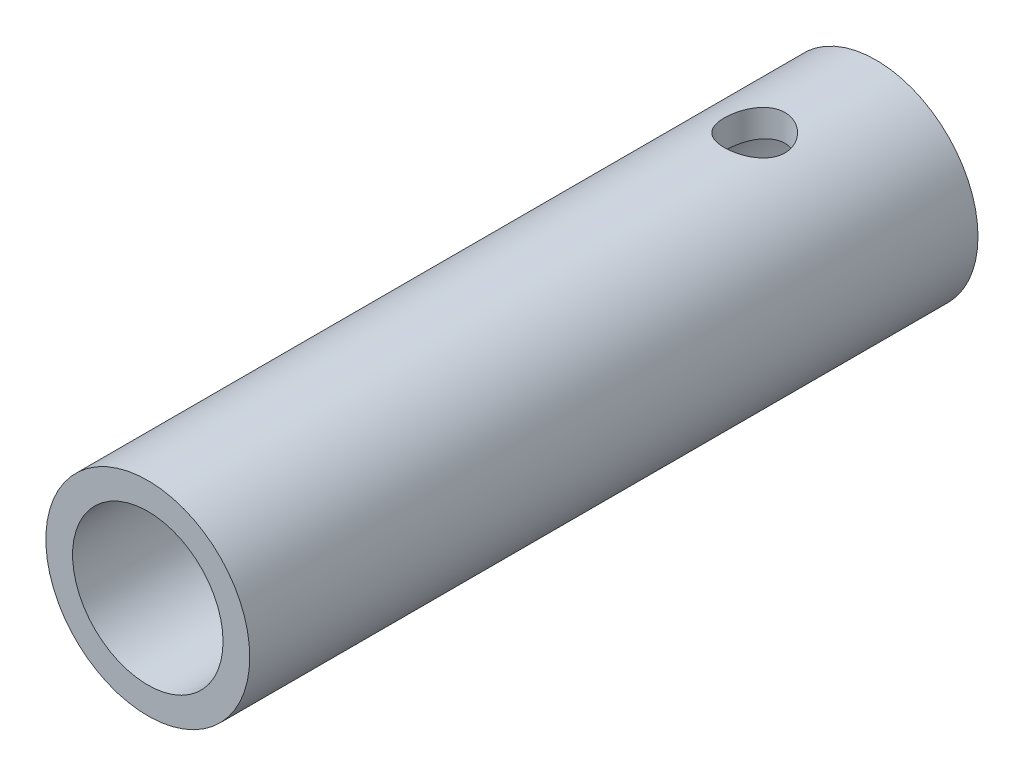
ISO-10303-21;
HEADER;
FILE_DESCRIPTION(('STEP AP214'),'2;1');
FILE_NAME('part.step','',(''),(''),'','','');
FILE_SCHEMA(('AUTOMOTIVE_DESIGN { 1 0 10303 214 1 1 1 1 }'));
ENDSEC;
DATA;
#1=APPLICATION_CONTEXT('core data for automotive mechanical design processes');
#2=APPLICATION_PROTOCOL_DEFINITION('international standard','automotive_design',2000,#1);
#3=PRODUCT_CONTEXT('',#1,'mechanical');
#4=PRODUCT('Part','Part','',(#3));
#5=PRODUCT_RELATED_PRODUCT_CATEGORY('part','',(#4));
#6=PRODUCT_DEFINITION_FORMATION('','',#4);
#7=PRODUCT_DEFINITION_CONTEXT('part definition',#1,'design');
#8=PRODUCT_DEFINITION('design','',#6,#7);
#9=PRODUCT_DEFINITION_SHAPE('','',#8);
#10=(LENGTH_UNIT() NAMED_UNIT(*) SI_UNIT(.MILLI.,.METRE.));
#11=(NAMED_UNIT(*) PLANE_ANGLE_UNIT() SI_UNIT($,.RADIAN.));
#12=(NAMED_UNIT(*) SI_UNIT($,.STERADIAN.) SOLID_ANGLE_UNIT());
#13=UNCERTAINTY_MEASURE_WITH_UNIT(LENGTH_MEASURE(1.E-05),#10,'distance_accuracy_value','');
#14=(GEOMETRIC_REPRESENTATION_CONTEXT(3) GLOBAL_UNCERTAINTY_ASSIGNED_CONTEXT((#13)) GLOBAL_UNIT_ASSIGNED_CONTEXT((#10,
#11,#12)) REPRESENTATION_CONTEXT('',''));
#15=CARTESIAN_POINT('',(0.,0.,0.));
#16=DIRECTION('',(0.,0.,1.));
#17=DIRECTION('',(1.,0.,0.));
#18=AXIS2_PLACEMENT_3D('',#15,#16,#17);
#19=CARTESIAN_POINT('',(0.,0.,76.2));
#20=DIRECTION('',(0.,0.,-1.));
#21=DIRECTION('',(-1.,0.,0.));
#22=AXIS2_PLACEMENT_3D('',#19,#20,#21);
#23=CYLINDRICAL_SURFACE('',#22,10.668);
#24=CARTESIAN_POINT('',(0.,0.,0.));
#25=DIRECTION('',(0.,0.,1.));
#26=DIRECTION('',(1.,0.,0.));
#27=AXIS2_PLACEMENT_3D('',#24,#25,#26);
#28=CIRCLE('',#27,10.668);
#29=CARTESIAN_POINT('',(10.668,0.,0.));
#30=VERTEX_POINT('',#29);
#31=EDGE_CURVE('E43',#30,#30,#28,.T.);
#32=ORIENTED_EDGE('',*,*,#31,.T.);
#33=EDGE_LOOP('',(#32));
#34=FACE_BOUND('',#33,.T.);
#35=CARTESIAN_POINT('',(0.,0.,76.2));
#36=DIRECTION('',(0.,0.,1.));
#37=DIRECTION('',(1.,0.,0.));
#38=AXIS2_PLACEMENT_3D('',#35,#36,#37);
#39=CIRCLE('',#38,10.668);
#40=CARTESIAN_POINT('',(10.668,0.,76.2));
#41=VERTEX_POINT('',#40);
#42=EDGE_CURVE('E10',#41,#41,#39,.T.);
#43=ORIENTED_EDGE('',*,*,#42,.F.);
#44=EDGE_LOOP('',(#43));
#45=FACE_BOUND('',#44,.T.);
#46=CARTESIAN_POINT('',(0.,10.668,9.525));
#47=CARTESIAN_POINT('',(-0.174241325798979,10.6679983960858,9.52500228316298));
#48=CARTESIAN_POINT('',(-0.348505769718592,10.663690253687,9.53939092403072));
#49=CARTESIAN_POINT('',(-0.691963975244289,10.6469249119002,9.59643133889868));
#50=CARTESIAN_POINT('',(-0.861156138697905,10.6344651717849,9.63909192488252));
#51=CARTESIAN_POINT('',(-1.18946602529507,10.6027626306626,9.75112864588402));
#52=CARTESIAN_POINT('',(-1.34859808012051,10.5835297478454,9.82046573107152));
#53=CARTESIAN_POINT('',(-1.65297729371737,10.5402824385384,9.98372822521061));
#54=CARTESIAN_POINT('',(-1.79822266758611,10.5162673986012,10.0776567892044));
#55=CARTESIAN_POINT('',(-2.07481627478839,10.4652596895976,10.290237431406));
#56=CARTESIAN_POINT('',(-2.20571596367365,10.4382067296833,10.4094586216231));
#57=CARTESIAN_POINT('',(-2.44599015594712,10.3845338725826,10.6680270430581));
#58=CARTESIAN_POINT('',(-2.55536110629125,10.3579140475435,10.807377589801));
#59=CARTESIAN_POINT('',(-2.75182038420357,10.3074852210202,11.1060281772563));
#60=CARTESIAN_POINT('',(-2.83836360168893,10.2837512292981,11.265700658118));
#61=CARTESIAN_POINT('',(-2.98318793361104,10.2426813335056,11.598153105723));
#62=CARTESIAN_POINT('',(-3.04147571365023,10.2253439206801,11.7709299699419));
#63=CARTESIAN_POINT('',(-3.12652161842141,10.1996580464263,12.1196548209246));
#64=CARTESIAN_POINT('',(-3.15410568071774,10.1910746627368,12.2953836161652));
#65=CARTESIAN_POINT('',(-3.17953994989377,10.1831695936336,12.6491682162967));
#66=CARTESIAN_POINT('',(-3.17739723298511,10.1838457040741,12.8272234573148));
#67=CARTESIAN_POINT('',(-3.14408802463311,10.194174868979,13.1739109025234));
#68=CARTESIAN_POINT('',(-3.11395355565029,10.2035087059639,13.3426533429279));
#69=CARTESIAN_POINT('',(-3.02718257140115,10.229585605295,13.67257019289));
#70=CARTESIAN_POINT('',(-2.97054347796374,10.2463293884166,13.8337438645359));
#71=CARTESIAN_POINT('',(-2.83160492525776,10.2855962413935,14.1464846873133));
#72=CARTESIAN_POINT('',(-2.74896875243333,10.3081944171753,14.2978924171281));
#73=CARTESIAN_POINT('',(-2.56061586104352,10.3565873921407,14.5850389975501));
#74=CARTESIAN_POINT('',(-2.45489362522584,10.3823829548177,14.7207740907372));
#75=CARTESIAN_POINT('',(-2.21823280435957,10.4355613868351,14.9785791567882));
#76=CARTESIAN_POINT('',(-2.08643698621044,10.4629659387667,15.0998590666317));
#77=CARTESIAN_POINT('',(-1.80403659978558,10.5153350237883,15.318777728031));
#78=CARTESIAN_POINT('',(-1.65343088551504,10.5402994080456,15.416415038093));
#79=CARTESIAN_POINT('',(-1.33626596775482,10.5851972570897,15.5857465027601));
#80=CARTESIAN_POINT('',(-1.169609388492,10.6050969503946,15.6572678215974));
#81=CARTESIAN_POINT('',(-0.825903850119206,10.6373799049131,15.7710343379057));
#82=CARTESIAN_POINT('',(-0.648857756549915,10.6497652280844,15.8132875670493));
#83=CARTESIAN_POINT('',(-0.296117315304111,10.6652988817217,15.8660088051819));
#84=CARTESIAN_POINT('',(-0.120596502078201,10.6687583212199,15.8775478219771));
#85=CARTESIAN_POINT('',(0.229883834507487,10.6669617810423,15.8715116580708));
#86=CARTESIAN_POINT('',(0.404843428479859,10.6617069446461,15.8539402965396));
#87=CARTESIAN_POINT('',(0.745208992948604,10.643275772405,15.7910492052107));
#88=CARTESIAN_POINT('',(0.910740764843499,10.6302776016207,15.7463531624451));
#89=CARTESIAN_POINT('',(1.2319213494107,10.5978616261517,15.6312298831209));
#90=CARTESIAN_POINT('',(1.38756897845934,10.5784430543473,15.5607995716848));
#91=CARTESIAN_POINT('',(1.68852037058663,10.5346472718176,15.3943952595501));
#92=CARTESIAN_POINT('',(1.83350578916012,10.5101667272377,15.2978734384314));
#93=CARTESIAN_POINT('',(2.10558731745912,10.4590593318239,15.0826933470306));
#94=CARTESIAN_POINT('',(2.23267899903917,10.4324319522697,14.9640296141464));
#95=CARTESIAN_POINT('',(2.47006655384872,10.3788414387626,14.7029039430776));
#96=CARTESIAN_POINT('',(2.57960079803834,10.3519002572243,14.5597436200586));
#97=CARTESIAN_POINT('',(2.77314170475635,10.3017445471305,14.2564893490367));
#98=CARTESIAN_POINT('',(2.85714907894139,10.2785299146922,14.0963958732764));
#99=CARTESIAN_POINT('',(2.99666928510632,10.2387239550074,13.764358367096));
#100=CARTESIAN_POINT('',(3.05231840598675,10.2221010354407,13.5924756098357));
#101=CARTESIAN_POINT('',(3.13372176127758,10.1974435977043,13.2411934819639));
#102=CARTESIAN_POINT('',(3.15948603509964,10.1894061954176,13.061796656598));
#103=CARTESIAN_POINT('',(3.17971326124283,10.1831108133343,12.7084819857639));
#104=CARTESIAN_POINT('',(3.17541637773946,10.1844653506752,12.5346411060563));
#105=CARTESIAN_POINT('',(3.13859728619281,10.1958714338903,12.1902800453339));
#106=CARTESIAN_POINT('',(3.10607617527586,10.2059226417094,12.019759735506));
#107=CARTESIAN_POINT('',(3.01452663009524,10.2333317083501,11.6888723898344));
#108=CARTESIAN_POINT('',(2.95582164324955,10.2506002528642,11.5284079194826));
#109=CARTESIAN_POINT('',(2.81382221009655,10.2904831123971,11.2194778652854));
#110=CARTESIAN_POINT('',(2.73052311530948,10.3130984378383,11.0710145565172));
#111=CARTESIAN_POINT('',(2.53819575001053,10.36214056438,10.7845336493571));
#112=CARTESIAN_POINT('',(2.42835082523999,10.3886750875462,10.6470827495105));
#113=CARTESIAN_POINT('',(2.18752601350922,10.4420372621739,10.3921626123225));
#114=CARTESIAN_POINT('',(2.05654067292693,10.4688649876037,10.2746985471181));
#115=CARTESIAN_POINT('',(1.77263817725277,10.5207110000946,10.0597398729351));
#116=CARTESIAN_POINT('',(1.61920070517846,10.5456555450635,9.96291285556676));
#117=CARTESIAN_POINT('',(1.29748174883532,10.5900455207758,9.79656735520946));
#118=CARTESIAN_POINT('',(1.12920745689311,10.6094935969783,9.72703572861559));
#119=CARTESIAN_POINT('',(0.801950740567736,10.6389391252757,9.62370533452668));
#120=CARTESIAN_POINT('',(0.644019809566226,10.6497477238415,9.58679001045693));
#121=CARTESIAN_POINT('',(0.324065474816058,10.6642783361898,9.53743825332017));
#122=CARTESIAN_POINT('',(0.162042734629735,10.6680014916245,9.52499787668069));
#123=CARTESIAN_POINT('',(0.,10.668,9.525));
#124=B_SPLINE_CURVE_WITH_KNOTS('',3,(#46,#47,#48,#49,#50,#51,#52,#53,#54,#55,#56,#57,#58,#59,
#60,#61,#62,#63,#64,#65,#66,#67,#68,#69,#70,#71,#72,#73,#74,#75,#76,#77,#78,#79,#80,#81,#82,#83,
#84,#85,#86,#87,#88,#89,#90,#91,#92,#93,#94,#95,#96,#97,#98,#99,#100,#101,#102,#103,#104,#105,
#106,#107,#108,#109,#110,#111,#112,#113,#114,#115,#116,#117,#118,#119,#120,#121,#122,#123),
.UNSPECIFIED.,.T.,.F.,(4,2,2,2,2,2,2,2,2,2,2,2,2,2,2,2,2,2,2,2,2,2,2,2,2,2,2,2,2,2,2,2,2,2,2,2,
2,2,4),(0.,0.522128831352049,1.04442047979936,1.56595047381227,2.08754741199618,
2.62243825452057,3.15741730008771,3.70420451047305,4.25086266810598,4.7824307362963,
5.31387227131662,5.82646624578209,6.33911009191281,6.85868782530556,7.37838986681104,
7.9194336846377,8.46051048170767,9.00510587022621,9.54955175303638,10.0747476764531,
10.5998747016269,11.1133620678965,11.6269108086478,12.1522153124277,12.6776495851608,
13.2218427064299,13.7660206548952,14.307558034213,14.8489134386094,15.3680710506587,
15.8872084830245,16.400103396546,16.9130953133641,17.4445123052465,17.9760666072682,
18.5228310150779,19.0693318144058,19.5549847964458,20.0405595203143),.UNSPECIFIED.);
#125=CARTESIAN_POINT('',(0.,10.668,9.525));
#126=VERTEX_POINT('',#125);
#127=EDGE_CURVE('E53',#126,#126,#124,.T.);
#128=ORIENTED_EDGE('',*,*,#127,.F.);
#129=EDGE_LOOP('',(#128));
#130=FACE_BOUND('',#129,.T.);
#131=ADVANCED_FACE('F31',(#34,#45,#130),#23,.T.);
#132=CARTESIAN_POINT('',(0.,0.,76.2));
#133=DIRECTION('',(0.,0.,-1.));
#134=DIRECTION('',(-1.,0.,0.));
#135=AXIS2_PLACEMENT_3D('',#132,#133,#134);
#136=CYLINDRICAL_SURFACE('',#135,7.874);
#137=CARTESIAN_POINT('',(0.,0.,0.));
#138=DIRECTION('',(0.,0.,1.));
#139=DIRECTION('',(1.,0.,0.));
#140=AXIS2_PLACEMENT_3D('',#137,#138,#139);
#141=CIRCLE('',#140,7.874);
#142=CARTESIAN_POINT('',(7.874,0.,0.));
#143=VERTEX_POINT('',#142);
#144=EDGE_CURVE('E50',#143,#143,#141,.T.);
#145=ORIENTED_EDGE('',*,*,#144,.F.);
#146=EDGE_LOOP('',(#145));
#147=FACE_BOUND('',#146,.T.);
#148=CARTESIAN_POINT('',(0.,0.,76.2));
#149=DIRECTION('',(0.,0.,1.));
#150=DIRECTION('',(1.,0.,0.));
#151=AXIS2_PLACEMENT_3D('',#148,#149,#150);
#152=CIRCLE('',#151,7.874);
#153=CARTESIAN_POINT('',(7.874,0.,76.2));
#154=VERTEX_POINT('',#153);
#155=EDGE_CURVE('E48',#154,#154,#152,.T.);
#156=ORIENTED_EDGE('',*,*,#155,.T.);
#157=EDGE_LOOP('',(#156));
#158=FACE_BOUND('',#157,.T.);
#159=CARTESIAN_POINT('',(0.,7.87399999999999,9.525));
#160=CARTESIAN_POINT('',(-0.0853138065275104,7.87399881940996,9.52500171025468));
#161=CARTESIAN_POINT('',(-0.170655569118886,7.87260816109943,9.52844556288248));
#162=CARTESIAN_POINT('',(-0.34071365483012,7.8670870568026,9.54217835883683));
#163=CARTESIAN_POINT('',(-0.425429557306203,7.86295491243566,9.55247154541252));
#164=CARTESIAN_POINT('',(-0.678039818847453,7.84656037982231,9.59356273037689));
#165=CARTESIAN_POINT('',(-0.844145904456294,7.8303003155091,9.63457203094117));
#166=CARTESIAN_POINT('',(-1.16597633099032,7.78888379341851,9.74198140811266));
#167=CARTESIAN_POINT('',(-1.32173292526667,7.76375667937359,9.80829779418691));
#168=CARTESIAN_POINT('',(-1.61980477112046,7.70708234066068,9.96410449569322));
#169=CARTESIAN_POINT('',(-1.76212455210029,7.67553729080246,10.0535869637569));
#170=CARTESIAN_POINT('',(-2.03623294066059,7.60752595910327,10.2576966865466));
#171=CARTESIAN_POINT('',(-2.16729406416504,7.57090528781625,10.3732484719218));
#172=CARTESIAN_POINT('',(-2.40879713559217,7.49756820349839,10.62426480506));
#173=CARTESIAN_POINT('',(-2.51922885234362,7.46085175206969,10.7597391742339));
#174=CARTESIAN_POINT('',(-2.72127432337628,7.38962484616999,11.0542201267361));
#175=CARTESIAN_POINT('',(-2.81180642099636,7.35529016554302,11.214015722861));
#176=CARTESIAN_POINT('',(-2.96438328075605,7.29514110783972,11.5481570334634));
#177=CARTESIAN_POINT('',(-3.02644179233511,7.26932262012663,11.7224956771683));
#178=CARTESIAN_POINT('',(-3.11735731028281,7.23078908211499,12.0724169373282));
#179=CARTESIAN_POINT('',(-3.14760766678057,7.21752692150469,12.2475750651384));
#180=CARTESIAN_POINT('',(-3.17839972786044,7.20402411896809,12.6009446740777));
#181=CARTESIAN_POINT('',(-3.17895636979412,7.20377692989252,12.7791545748846));
#182=CARTESIAN_POINT('',(-3.15139986911577,7.21586598122804,13.1200879308222));
#183=CARTESIAN_POINT('',(-3.12531734809013,7.22731097779205,13.2830132970359));
#184=CARTESIAN_POINT('',(-3.04861261148164,7.2599970139528,13.6019408630529));
#185=CARTESIAN_POINT('',(-2.99798603661225,7.28123979370803,13.7579418276338));
#186=CARTESIAN_POINT('',(-2.87266148125854,7.33159711138427,14.0623906948545));
#187=CARTESIAN_POINT('',(-2.7974894289216,7.36086469262606,14.2106170042476));
#188=CARTESIAN_POINT('',(-2.62554103256057,7.42393306054218,14.4929024266639));
#189=CARTESIAN_POINT('',(-2.52875649293859,7.45773556494299,14.626956136855));
#190=CARTESIAN_POINT('',(-2.30738329559367,7.52930314782267,14.8881888766332));
#191=CARTESIAN_POINT('',(-2.18120631669873,7.56717076283725,15.0139974926657));
#192=CARTESIAN_POINT('',(-1.90914693107844,7.6403442972344,15.2431117618252));
#193=CARTESIAN_POINT('',(-1.76326048229995,7.67564968886261,15.3464127876719));
#194=CARTESIAN_POINT('',(-1.4519834597174,7.74063128710988,15.5294176322225));
#195=CARTESIAN_POINT('',(-1.28625612038942,7.770178177633,15.6085979120651));
#196=CARTESIAN_POINT('',(-0.942339676136121,7.81933319563992,15.7374815374064));
#197=CARTESIAN_POINT('',(-0.764157061091356,7.83894645580241,15.787200107949));
#198=CARTESIAN_POINT('',(-0.411868434997358,7.86508441274245,15.8529590075563));
#199=CARTESIAN_POINT('',(-0.238158955914311,7.87232361132224,15.8708405169537));
#200=CARTESIAN_POINT('',(0.109913125954055,7.8751541874265,15.8778643129595));
#201=CARTESIAN_POINT('',(0.284275543869656,7.87074864475774,15.8670141985202));
#202=CARTESIAN_POINT('',(0.6203059446048,7.85125168274721,15.8182299031215));
#203=CARTESIAN_POINT('',(0.782189526574386,7.83665910845881,15.7815594147835));
#204=CARTESIAN_POINT('',(1.09735153985033,7.79877594743778,15.683902264491));
#205=CARTESIAN_POINT('',(1.2506288659423,7.77548424648976,15.622912487567));
#206=CARTESIAN_POINT('',(1.5495252628004,7.7215691192632,15.4763561219391));
#207=CARTESIAN_POINT('',(1.6947647474782,7.69074255592152,15.3900924886928));
#208=CARTESIAN_POINT('',(1.9692191024373,7.62508998345414,15.1962089262388));
#209=CARTESIAN_POINT('',(2.09842745965652,7.59026235978888,15.088580362843));
#210=CARTESIAN_POINT('',(2.34624639570532,7.51749887820836,14.8465601757736));
#211=CARTESIAN_POINT('',(2.46356495844851,7.47951121875179,14.710857710926));
#212=CARTESIAN_POINT('',(2.67409019313409,7.40685850541486,14.4210318298002));
#213=CARTESIAN_POINT('',(2.76729262031798,7.37219403713504,14.2669051775919));
#214=CARTESIAN_POINT('',(2.92760488751249,7.31002813647436,13.9421241042947));
#215=CARTESIAN_POINT('',(2.99443010034691,7.28260584447471,13.7713129543371));
#216=CARTESIAN_POINT('',(3.09784166451536,7.23923042543574,13.4194200871203));
#217=CARTESIAN_POINT('',(3.1344508273425,7.223268647511,13.2383462282291));
#218=CARTESIAN_POINT('',(3.1741950512847,7.20588570117557,12.8853013130874));
#219=CARTESIAN_POINT('',(3.17957712065925,7.20348878444623,12.713629764344));
#220=CARTESIAN_POINT('',(3.16263373946768,7.21094375400632,12.371947894504));
#221=CARTESIAN_POINT('',(3.14031193750608,7.22079402733906,12.2019373576237));
#222=CARTESIAN_POINT('',(3.0704400285169,7.25076670667075,11.8755249299626));
#223=CARTESIAN_POINT('',(3.02395739930063,7.27045320090325,11.7188508228141));
#224=CARTESIAN_POINT('',(2.90808989717554,7.31756650255749,11.4154671868187));
#225=CARTESIAN_POINT('',(2.83869867713796,7.34499545482417,11.2687604331577));
#226=CARTESIAN_POINT('',(2.67435156286363,7.40647236593437,10.9802294462676));
#227=CARTESIAN_POINT('',(2.578149222479,7.44081139200889,10.8391783348537));
#228=CARTESIAN_POINT('',(2.36471003282482,7.51136725763288,10.574514804294));
#229=CARTESIAN_POINT('',(2.24746665718648,7.54758467732478,10.4509078171616));
#230=CARTESIAN_POINT('',(1.98605128191549,7.62070147481599,10.2162332271086));
#231=CARTESIAN_POINT('',(1.84060885823373,7.65748671307923,10.1065413960451));
#232=CARTESIAN_POINT('',(1.53189158073065,7.72515755582715,9.91305520561315));
#233=CARTESIAN_POINT('',(1.36860852242476,7.75604042785347,9.82927282980275));
#234=CARTESIAN_POINT('',(1.11544104764093,7.79505300718687,9.72601843389095));
#235=CARTESIAN_POINT('',(1.03045664945645,7.80676698725231,9.69550901777487));
#236=CARTESIAN_POINT('',(0.857919448827435,7.82760347443312,9.64177412207535));
#237=CARTESIAN_POINT('',(0.770367866333487,7.83672719113316,9.6185452421448));
#238=CARTESIAN_POINT('',(0.593592483724013,7.85209418620097,9.5796717731791));
#239=CARTESIAN_POINT('',(0.504373518171901,7.85834475183656,9.56400799135674));
#240=CARTESIAN_POINT('',(0.324807824619729,7.86781060535872,9.54036191192722));
#241=CARTESIAN_POINT('',(0.234461932692077,7.87102802193401,9.53237422709624));
#242=CARTESIAN_POINT('',(0.0959969096121469,7.87356143505396,9.52608782014511));
#243=CARTESIAN_POINT('',(0.0480028800985476,7.87400066427374,9.52499903770382));
#244=CARTESIAN_POINT('',(0.,7.87399999999999,9.525));
#245=B_SPLINE_CURVE_WITH_KNOTS('',3,(#159,#160,#161,#162,#163,#164,#165,#166,#167,#168,#169,
#170,#171,#172,#173,#174,#175,#176,#177,#178,#179,#180,#181,#182,#183,#184,#185,#186,#187,#188,
#189,#190,#191,#192,#193,#194,#195,#196,#197,#198,#199,#200,#201,#202,#203,#204,#205,#206,#207,
#208,#209,#210,#211,#212,#213,#214,#215,#216,#217,#218,#219,#220,#221,#222,#223,#224,#225,#226,
#227,#228,#229,#230,#231,#232,#233,#234,#235,#236,#237,#238,#239,#240,#241,#242,#243,#244),
.UNSPECIFIED.,.T.,.F.,(4,2,2,2,2,2,2,2,2,2,2,2,2,2,2,2,2,2,2,2,2,2,2,2,2,2,2,2,2,2,2,2,2,2,2,2,
2,2,2,2,2,2,4),(0.,0.255899731194885,0.511958143293918,1.02481747902563,1.53599528385105,
2.04700015638134,2.58023537841372,3.11373436083282,3.67144871720276,4.22889347805397,
4.76074855451206,5.2923360800311,5.78622044005092,6.28019255137073,6.78433340628689,
7.28866576036916,7.83267264572705,8.37679126682102,8.93199359096604,9.48690875022953,
10.0085395584562,10.5300324193213,11.0276319412519,11.5252952193857,12.0382372063084,
12.5513869115499,13.098953460348,13.6466163226326,14.2000370531299,14.7530395975857,
15.2657026583338,15.7782982084344,16.2699608120375,16.7617597517652,17.2820024165533,
17.8024067265347,18.3573331353433,18.9125158243838,19.1853715807685,19.4580997103417,
19.7301322410375,20.0019737146484,20.1459588984515),.UNSPECIFIED.);
#246=CARTESIAN_POINT('',(0.,7.87399999999999,9.525));
#247=VERTEX_POINT('',#246);
#248=EDGE_CURVE('E35',#247,#247,#245,.T.);
#249=ORIENTED_EDGE('',*,*,#248,.T.);
#250=EDGE_LOOP('',(#249));
#251=FACE_BOUND('',#250,.T.);
#252=ADVANCED_FACE('F64',(#147,#158,#251),#136,.F.);
#253=CARTESIAN_POINT('',(0.,0.,76.2));
#254=DIRECTION('',(0.,0.,1.));
#255=DIRECTION('',(1.,0.,0.));
#256=AXIS2_PLACEMENT_3D('',#253,#254,#255);
#257=PLANE('',#256);
#258=ORIENTED_EDGE('',*,*,#42,.T.);
#259=EDGE_LOOP('',(#258));
#260=FACE_BOUND('',#259,.T.);
#261=ORIENTED_EDGE('',*,*,#155,.F.);
#262=EDGE_LOOP('',(#261));
#263=FACE_BOUND('',#262,.T.);
#264=ADVANCED_FACE('F69',(#260,#263),#257,.T.);
#265=CARTESIAN_POINT('',(0.,0.,0.));
#266=DIRECTION('',(0.,0.,1.));
#267=DIRECTION('',(1.,0.,0.));
#268=AXIS2_PLACEMENT_3D('',#265,#266,#267);
#269=PLANE('',#268);
#270=ORIENTED_EDGE('',*,*,#31,.F.);
#271=EDGE_LOOP('',(#270));
#272=FACE_BOUND('',#271,.T.);
#273=ORIENTED_EDGE('',*,*,#144,.T.);
#274=EDGE_LOOP('',(#273));
#275=FACE_BOUND('',#274,.T.);
#276=ADVANCED_FACE('F62',(#272,#275),#269,.F.);
#277=CARTESIAN_POINT('',(0.,26.9,12.7));
#278=DIRECTION('',(0.,-1.,0.));
#279=DIRECTION('',(0.,0.,-1.));
#280=AXIS2_PLACEMENT_3D('',#277,#278,#279);
#281=CYLINDRICAL_SURFACE('',#280,3.175);
#282=ORIENTED_EDGE('',*,*,#248,.F.);
#283=EDGE_LOOP('',(#282));
#284=FACE_BOUND('',#283,.T.);
#285=ORIENTED_EDGE('',*,*,#127,.T.);
#286=EDGE_LOOP('',(#285));
#287=FACE_BOUND('',#286,.T.);
#288=ADVANCED_FACE('F59',(#284,#287),#281,.F.);
#289=CLOSED_SHELL('',(#131,#252,#264,#276,#288));
#290=MANIFOLD_SOLID_BREP('B2',#289);
#291=ADVANCED_BREP_SHAPE_REPRESENTATION('',(#18,#290),#14);
#292=SHAPE_DEFINITION_REPRESENTATION(#9,#291);
ENDSEC;
END-ISO-10303-21;
